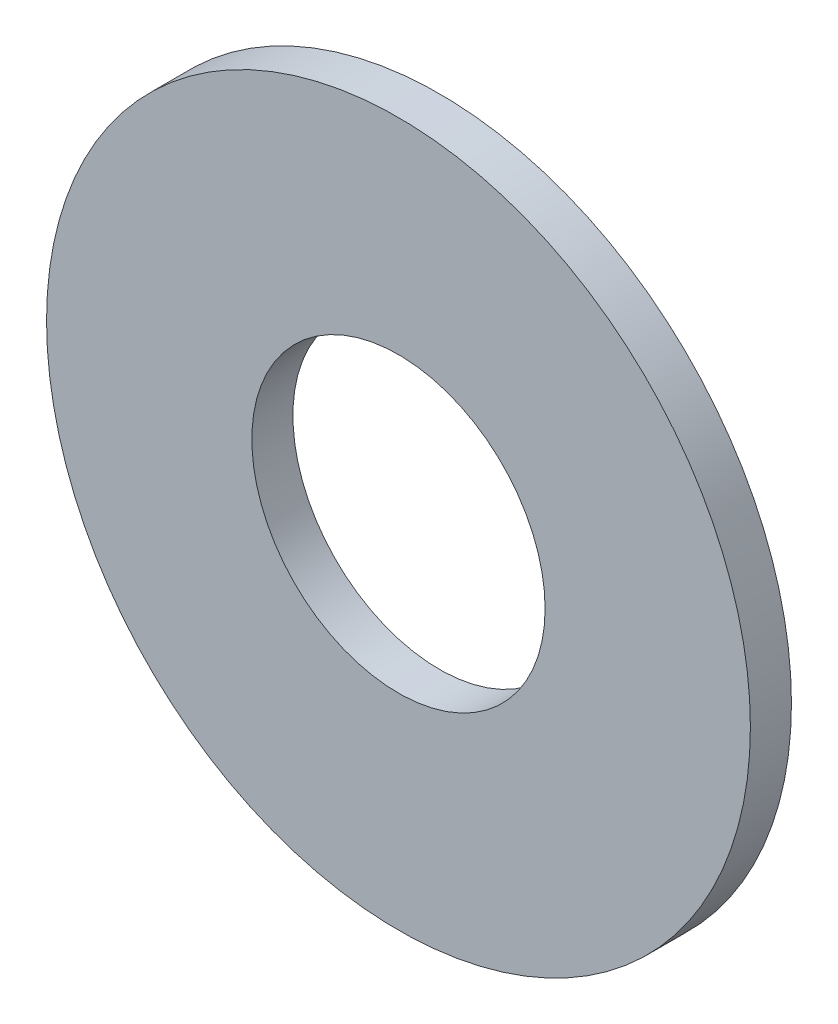
ISO-10303-21;
HEADER;
FILE_DESCRIPTION(('STEP AP214'),'2;1');
FILE_NAME('part.step','',(''),(''),'','','');
FILE_SCHEMA(('AUTOMOTIVE_DESIGN { 1 0 10303 214 1 1 1 1 }'));
ENDSEC;
DATA;
#1=APPLICATION_CONTEXT('core data for automotive mechanical design processes');
#2=APPLICATION_PROTOCOL_DEFINITION('international standard','automotive_design',2000,#1);
#3=PRODUCT_CONTEXT('',#1,'mechanical');
#4=PRODUCT('Part','Part','',(#3));
#5=PRODUCT_RELATED_PRODUCT_CATEGORY('part','',(#4));
#6=PRODUCT_DEFINITION_FORMATION('','',#4);
#7=PRODUCT_DEFINITION_CONTEXT('part definition',#1,'design');
#8=PRODUCT_DEFINITION('design','',#6,#7);
#9=PRODUCT_DEFINITION_SHAPE('','',#8);
#10=(LENGTH_UNIT() NAMED_UNIT(*) SI_UNIT(.MILLI.,.METRE.));
#11=(NAMED_UNIT(*) PLANE_ANGLE_UNIT() SI_UNIT($,.RADIAN.));
#12=(NAMED_UNIT(*) SI_UNIT($,.STERADIAN.) SOLID_ANGLE_UNIT());
#13=UNCERTAINTY_MEASURE_WITH_UNIT(LENGTH_MEASURE(1.E-05),#10,'distance_accuracy_value','');
#14=(GEOMETRIC_REPRESENTATION_CONTEXT(3) GLOBAL_UNCERTAINTY_ASSIGNED_CONTEXT((#13)) GLOBAL_UNIT_ASSIGNED_CONTEXT((#10,
#11,#12)) REPRESENTATION_CONTEXT('',''));
#15=CARTESIAN_POINT('',(0.,0.,0.));
#16=DIRECTION('',(0.,0.,1.));
#17=DIRECTION('',(1.,0.,0.));
#18=AXIS2_PLACEMENT_3D('',#15,#16,#17);
#19=CARTESIAN_POINT('',(0.,0.,1.4));
#20=DIRECTION('',(0.,0.,1.));
#21=DIRECTION('',(1.,0.,0.));
#22=AXIS2_PLACEMENT_3D('',#19,#20,#21);
#23=PLANE('',#22);
#24=CARTESIAN_POINT('',(0.,0.,1.4));
#25=DIRECTION('',(0.,0.,1.));
#26=DIRECTION('',(1.,0.,0.));
#27=AXIS2_PLACEMENT_3D('',#24,#25,#26);
#28=CIRCLE('',#27,12.);
#29=CARTESIAN_POINT('',(12.,0.,1.4));
#30=VERTEX_POINT('',#29);
#31=EDGE_CURVE('E10',#30,#30,#28,.T.);
#32=ORIENTED_EDGE('',*,*,#31,.T.);
#33=EDGE_LOOP('',(#32));
#34=FACE_BOUND('',#33,.T.);
#35=CARTESIAN_POINT('',(0.,0.,1.4));
#36=DIRECTION('',(0.,0.,1.));
#37=DIRECTION('',(1.,0.,0.));
#38=AXIS2_PLACEMENT_3D('',#35,#36,#37);
#39=CIRCLE('',#38,5.);
#40=CARTESIAN_POINT('',(5.,0.,1.4));
#41=VERTEX_POINT('',#40);
#42=EDGE_CURVE('E41',#41,#41,#39,.T.);
#43=ORIENTED_EDGE('',*,*,#42,.F.);
#44=EDGE_LOOP('',(#43));
#45=FACE_BOUND('',#44,.T.);
#46=ADVANCED_FACE('F30',(#34,#45),#23,.T.);
#47=CARTESIAN_POINT('',(0.,0.,0.));
#48=DIRECTION('',(0.,0.,1.));
#49=DIRECTION('',(1.,0.,0.));
#50=AXIS2_PLACEMENT_3D('',#47,#48,#49);
#51=PLANE('',#50);
#52=CARTESIAN_POINT('',(0.,0.,0.));
#53=DIRECTION('',(0.,0.,1.));
#54=DIRECTION('',(1.,0.,0.));
#55=AXIS2_PLACEMENT_3D('',#52,#53,#54);
#56=CIRCLE('',#55,12.);
#57=CARTESIAN_POINT('',(12.,0.,0.));
#58=VERTEX_POINT('',#57);
#59=EDGE_CURVE('E34',#58,#58,#56,.T.);
#60=ORIENTED_EDGE('',*,*,#59,.F.);
#61=EDGE_LOOP('',(#60));
#62=FACE_BOUND('',#61,.T.);
#63=CARTESIAN_POINT('',(0.,0.,0.));
#64=DIRECTION('',(0.,0.,1.));
#65=DIRECTION('',(1.,0.,0.));
#66=AXIS2_PLACEMENT_3D('',#63,#64,#65);
#67=CIRCLE('',#66,5.);
#68=CARTESIAN_POINT('',(5.,0.,0.));
#69=VERTEX_POINT('',#68);
#70=EDGE_CURVE('E43',#69,#69,#67,.T.);
#71=ORIENTED_EDGE('',*,*,#70,.T.);
#72=EDGE_LOOP('',(#71));
#73=FACE_BOUND('',#72,.T.);
#74=ADVANCED_FACE('F53',(#62,#73),#51,.F.);
#75=CARTESIAN_POINT('',(0.,0.,1.4));
#76=DIRECTION('',(0.,0.,-1.));
#77=DIRECTION('',(-1.,0.,0.));
#78=AXIS2_PLACEMENT_3D('',#75,#76,#77);
#79=CYLINDRICAL_SURFACE('',#78,12.);
#80=ORIENTED_EDGE('',*,*,#31,.F.);
#81=EDGE_LOOP('',(#80));
#82=FACE_BOUND('',#81,.T.);
#83=ORIENTED_EDGE('',*,*,#59,.T.);
#84=EDGE_LOOP('',(#83));
#85=FACE_BOUND('',#84,.T.);
#86=ADVANCED_FACE('F32',(#82,#85),#79,.T.);
#87=CARTESIAN_POINT('',(0.,0.,1.4));
#88=DIRECTION('',(0.,0.,-1.));
#89=DIRECTION('',(-1.,0.,0.));
#90=AXIS2_PLACEMENT_3D('',#87,#88,#89);
#91=CYLINDRICAL_SURFACE('',#90,5.);
#92=ORIENTED_EDGE('',*,*,#42,.T.);
#93=EDGE_LOOP('',(#92));
#94=FACE_BOUND('',#93,.T.);
#95=ORIENTED_EDGE('',*,*,#70,.F.);
#96=EDGE_LOOP('',(#95));
#97=FACE_BOUND('',#96,.T.);
#98=ADVANCED_FACE('F49',(#94,#97),#91,.F.);
#99=CLOSED_SHELL('',(#46,#74,#86,#98));
#100=MANIFOLD_SOLID_BREP('B2',#99);
#101=ADVANCED_BREP_SHAPE_REPRESENTATION('',(#18,#100),#14);
#102=SHAPE_DEFINITION_REPRESENTATION(#9,#101);
ENDSEC;
END-ISO-10303-21;
